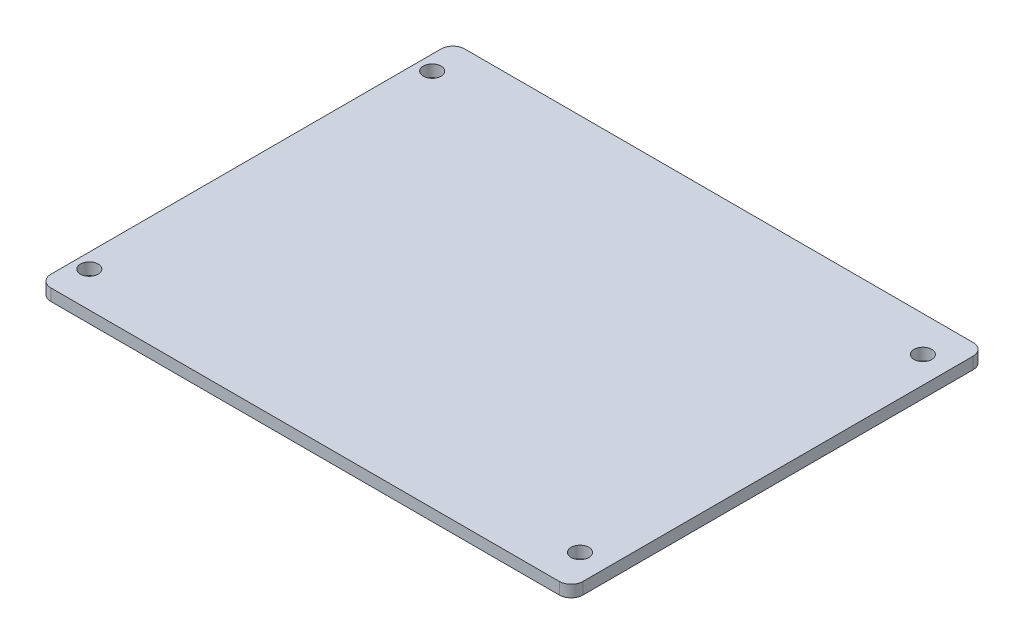
ISO-10303-21;
HEADER;
FILE_DESCRIPTION(('STEP AP214'),'2;1');
FILE_NAME('part.step','',(''),(''),'','','');
FILE_SCHEMA(('AUTOMOTIVE_DESIGN { 1 0 10303 214 1 1 1 1 }'));
ENDSEC;
DATA;
#1=APPLICATION_CONTEXT('core data for automotive mechanical design processes');
#2=APPLICATION_PROTOCOL_DEFINITION('international standard','automotive_design',2000,#1);
#3=PRODUCT_CONTEXT('',#1,'mechanical');
#4=PRODUCT('Part','Part','',(#3));
#5=PRODUCT_RELATED_PRODUCT_CATEGORY('part','',(#4));
#6=PRODUCT_DEFINITION_FORMATION('','',#4);
#7=PRODUCT_DEFINITION_CONTEXT('part definition',#1,'design');
#8=PRODUCT_DEFINITION('design','',#6,#7);
#9=PRODUCT_DEFINITION_SHAPE('','',#8);
#10=(LENGTH_UNIT() NAMED_UNIT(*) SI_UNIT(.MILLI.,.METRE.));
#11=(NAMED_UNIT(*) PLANE_ANGLE_UNIT() SI_UNIT($,.RADIAN.));
#12=(NAMED_UNIT(*) SI_UNIT($,.STERADIAN.) SOLID_ANGLE_UNIT());
#13=UNCERTAINTY_MEASURE_WITH_UNIT(LENGTH_MEASURE(1.E-05),#10,'distance_accuracy_value','');
#14=(GEOMETRIC_REPRESENTATION_CONTEXT(3) GLOBAL_UNCERTAINTY_ASSIGNED_CONTEXT((#13)) GLOBAL_UNIT_ASSIGNED_CONTEXT((#10,
#11,#12)) REPRESENTATION_CONTEXT('',''));
#15=CARTESIAN_POINT('',(0.,0.,0.));
#16=DIRECTION('',(0.,0.,1.));
#17=DIRECTION('',(1.,0.,0.));
#18=AXIS2_PLACEMENT_3D('',#15,#16,#17);
#19=CARTESIAN_POINT('',(0.,2.,0.));
#20=DIRECTION('',(0.,1.,0.));
#21=DIRECTION('',(0.,0.,1.));
#22=AXIS2_PLACEMENT_3D('',#19,#20,#21);
#23=PLANE('',#22);
#24=CARTESIAN_POINT('',(40.5,2.,-29.));
#25=DIRECTION('',(0.,1.,0.));
#26=DIRECTION('',(0.,0.,1.));
#27=AXIS2_PLACEMENT_3D('',#24,#25,#26);
#28=CIRCLE('',#27,1.5);
#29=CARTESIAN_POINT('',(40.5,2.,-27.5));
#30=VERTEX_POINT('',#29);
#31=EDGE_CURVE('E219',#30,#30,#28,.T.);
#32=ORIENTED_EDGE('',*,*,#31,.F.);
#33=EDGE_LOOP('',(#32));
#34=FACE_BOUND('',#33,.T.);
#35=CARTESIAN_POINT('',(-42.5,2.,29.));
#36=DIRECTION('',(0.,1.,0.));
#37=DIRECTION('',(0.,0.,1.));
#38=AXIS2_PLACEMENT_3D('',#35,#36,#37);
#39=CIRCLE('',#38,1.5);
#40=CARTESIAN_POINT('',(-42.5,2.,30.5));
#41=VERTEX_POINT('',#40);
#42=EDGE_CURVE('E144',#41,#41,#39,.T.);
#43=ORIENTED_EDGE('',*,*,#42,.F.);
#44=EDGE_LOOP('',(#43));
#45=FACE_BOUND('',#44,.T.);
#46=DIRECTION('',(0.,0.,1.));
#47=VECTOR('',#46,1.);
#48=CARTESIAN_POINT('',(-45.,2.,-35.));
#49=LINE('',#48,#47);
#50=CARTESIAN_POINT('',(-45.,2.,-33.));
#51=VERTEX_POINT('',#50);
#52=CARTESIAN_POINT('',(-45.,2.,33.));
#53=VERTEX_POINT('',#52);
#54=EDGE_CURVE('E150',#51,#53,#49,.T.);
#55=ORIENTED_EDGE('',*,*,#54,.T.);
#56=CARTESIAN_POINT('',(-43.,2.,33.));
#57=DIRECTION('',(0.,1.,0.));
#58=DIRECTION('',(0.,0.,1.));
#59=AXIS2_PLACEMENT_3D('',#56,#57,#58);
#60=CIRCLE('',#59,2.);
#61=CARTESIAN_POINT('',(-43.,2.,35.));
#62=VERTEX_POINT('',#61);
#63=EDGE_CURVE('E174',#53,#62,#60,.T.);
#64=ORIENTED_EDGE('',*,*,#63,.T.);
#65=DIRECTION('',(1.,0.,0.));
#66=VECTOR('',#65,1.);
#67=CARTESIAN_POINT('',(-45.,2.,35.));
#68=LINE('',#67,#66);
#69=CARTESIAN_POINT('',(43.,2.,35.));
#70=VERTEX_POINT('',#69);
#71=EDGE_CURVE('E127',#62,#70,#68,.T.);
#72=ORIENTED_EDGE('',*,*,#71,.T.);
#73=CARTESIAN_POINT('',(43.,2.,33.));
#74=DIRECTION('',(0.,1.,0.));
#75=DIRECTION('',(0.,0.,1.));
#76=AXIS2_PLACEMENT_3D('',#73,#74,#75);
#77=CIRCLE('',#76,2.);
#78=CARTESIAN_POINT('',(45.,2.,33.));
#79=VERTEX_POINT('',#78);
#80=EDGE_CURVE('E166',#70,#79,#77,.T.);
#81=ORIENTED_EDGE('',*,*,#80,.T.);
#82=DIRECTION('',(0.,0.,-1.));
#83=VECTOR('',#82,1.);
#84=CARTESIAN_POINT('',(45.,2.,-35.));
#85=LINE('',#84,#83);
#86=CARTESIAN_POINT('',(45.,2.,-33.));
#87=VERTEX_POINT('',#86);
#88=EDGE_CURVE('E189',#79,#87,#85,.T.);
#89=ORIENTED_EDGE('',*,*,#88,.T.);
#90=CARTESIAN_POINT('',(43.,2.,-33.));
#91=DIRECTION('',(0.,1.,0.));
#92=DIRECTION('',(0.,0.,1.));
#93=AXIS2_PLACEMENT_3D('',#90,#91,#92);
#94=CIRCLE('',#93,2.);
#95=CARTESIAN_POINT('',(43.,2.,-35.));
#96=VERTEX_POINT('',#95);
#97=EDGE_CURVE('E62',#87,#96,#94,.T.);
#98=ORIENTED_EDGE('',*,*,#97,.T.);
#99=DIRECTION('',(-1.,0.,0.));
#100=VECTOR('',#99,1.);
#101=CARTESIAN_POINT('',(-45.,2.,-35.));
#102=LINE('',#101,#100);
#103=CARTESIAN_POINT('',(-43.,2.,-35.));
#104=VERTEX_POINT('',#103);
#105=EDGE_CURVE('E152',#96,#104,#102,.T.);
#106=ORIENTED_EDGE('',*,*,#105,.T.);
#107=CARTESIAN_POINT('',(-43.,2.,-33.));
#108=DIRECTION('',(0.,1.,0.));
#109=DIRECTION('',(0.,0.,1.));
#110=AXIS2_PLACEMENT_3D('',#107,#108,#109);
#111=CIRCLE('',#110,2.);
#112=EDGE_CURVE('E171',#104,#51,#111,.T.);
#113=ORIENTED_EDGE('',*,*,#112,.T.);
#114=EDGE_LOOP('',(#55,#64,#72,#81,#89,#98,#106,#113));
#115=FACE_BOUND('',#114,.T.);
#116=CARTESIAN_POINT('',(-42.5,2.,-29.));
#117=DIRECTION('',(0.,1.,0.));
#118=DIRECTION('',(0.,0.,1.));
#119=AXIS2_PLACEMENT_3D('',#116,#117,#118);
#120=CIRCLE('',#119,1.5);
#121=CARTESIAN_POINT('',(-42.5,2.,-27.5));
#122=VERTEX_POINT('',#121);
#123=EDGE_CURVE('E211',#122,#122,#120,.T.);
#124=ORIENTED_EDGE('',*,*,#123,.F.);
#125=EDGE_LOOP('',(#124));
#126=FACE_BOUND('',#125,.T.);
#127=CARTESIAN_POINT('',(40.5,2.,29.));
#128=DIRECTION('',(0.,1.,0.));
#129=DIRECTION('',(0.,0.,1.));
#130=AXIS2_PLACEMENT_3D('',#127,#128,#129);
#131=CIRCLE('',#130,1.5);
#132=CARTESIAN_POINT('',(40.5,2.,30.5));
#133=VERTEX_POINT('',#132);
#134=EDGE_CURVE('E227',#133,#133,#131,.T.);
#135=ORIENTED_EDGE('',*,*,#134,.F.);
#136=EDGE_LOOP('',(#135));
#137=FACE_BOUND('',#136,.T.);
#138=ADVANCED_FACE('F39',(#34,#45,#115,#126,#137),#23,.T.);
#139=CARTESIAN_POINT('',(0.,0.,0.));
#140=DIRECTION('',(0.,1.,0.));
#141=DIRECTION('',(0.,0.,1.));
#142=AXIS2_PLACEMENT_3D('',#139,#140,#141);
#143=PLANE('',#142);
#144=DIRECTION('',(1.,0.,0.));
#145=VECTOR('',#144,1.);
#146=CARTESIAN_POINT('',(-45.,0.,35.));
#147=LINE('',#146,#145);
#148=CARTESIAN_POINT('',(-43.,0.,35.));
#149=VERTEX_POINT('',#148);
#150=CARTESIAN_POINT('',(43.,0.,35.));
#151=VERTEX_POINT('',#150);
#152=EDGE_CURVE('E124',#149,#151,#147,.T.);
#153=ORIENTED_EDGE('',*,*,#152,.F.);
#154=CARTESIAN_POINT('',(-43.,0.,33.));
#155=DIRECTION('',(0.,1.,0.));
#156=DIRECTION('',(0.,0.,1.));
#157=AXIS2_PLACEMENT_3D('',#154,#155,#156);
#158=CIRCLE('',#157,2.);
#159=CARTESIAN_POINT('',(-45.,0.,33.));
#160=VERTEX_POINT('',#159);
#161=EDGE_CURVE('E106',#149,#160,#158,.F.);
#162=ORIENTED_EDGE('',*,*,#161,.T.);
#163=DIRECTION('',(0.,0.,1.));
#164=VECTOR('',#163,1.);
#165=CARTESIAN_POINT('',(-45.,0.,-35.));
#166=LINE('',#165,#164);
#167=CARTESIAN_POINT('',(-45.,0.,-33.));
#168=VERTEX_POINT('',#167);
#169=EDGE_CURVE('E137',#168,#160,#166,.T.);
#170=ORIENTED_EDGE('',*,*,#169,.F.);
#171=CARTESIAN_POINT('',(-43.,0.,-33.));
#172=DIRECTION('',(0.,1.,0.));
#173=DIRECTION('',(0.,0.,1.));
#174=AXIS2_PLACEMENT_3D('',#171,#172,#173);
#175=CIRCLE('',#174,2.);
#176=CARTESIAN_POINT('',(-43.,0.,-35.));
#177=VERTEX_POINT('',#176);
#178=EDGE_CURVE('E118',#168,#177,#175,.F.);
#179=ORIENTED_EDGE('',*,*,#178,.T.);
#180=DIRECTION('',(-1.,0.,0.));
#181=VECTOR('',#180,1.);
#182=CARTESIAN_POINT('',(-45.,0.,-35.));
#183=LINE('',#182,#181);
#184=CARTESIAN_POINT('',(43.,0.,-35.));
#185=VERTEX_POINT('',#184);
#186=EDGE_CURVE('E142',#185,#177,#183,.T.);
#187=ORIENTED_EDGE('',*,*,#186,.F.);
#188=CARTESIAN_POINT('',(43.,0.,-33.));
#189=DIRECTION('',(0.,1.,0.));
#190=DIRECTION('',(0.,0.,1.));
#191=AXIS2_PLACEMENT_3D('',#188,#189,#190);
#192=CIRCLE('',#191,2.);
#193=CARTESIAN_POINT('',(45.,0.,-33.));
#194=VERTEX_POINT('',#193);
#195=EDGE_CURVE('E156',#185,#194,#192,.F.);
#196=ORIENTED_EDGE('',*,*,#195,.T.);
#197=DIRECTION('',(0.,0.,-1.));
#198=VECTOR('',#197,1.);
#199=CARTESIAN_POINT('',(45.,0.,-35.));
#200=LINE('',#199,#198);
#201=CARTESIAN_POINT('',(45.,0.,33.));
#202=VERTEX_POINT('',#201);
#203=EDGE_CURVE('E136',#202,#194,#200,.T.);
#204=ORIENTED_EDGE('',*,*,#203,.F.);
#205=CARTESIAN_POINT('',(43.,0.,33.));
#206=DIRECTION('',(0.,1.,0.));
#207=DIRECTION('',(0.,0.,1.));
#208=AXIS2_PLACEMENT_3D('',#205,#206,#207);
#209=CIRCLE('',#208,2.);
#210=EDGE_CURVE('E129',#202,#151,#209,.F.);
#211=ORIENTED_EDGE('',*,*,#210,.T.);
#212=EDGE_LOOP('',(#153,#162,#170,#179,#187,#196,#204,#211));
#213=FACE_BOUND('',#212,.T.);
#214=CARTESIAN_POINT('',(-42.5,0.,29.));
#215=DIRECTION('',(0.,1.,0.));
#216=DIRECTION('',(0.,0.,1.));
#217=AXIS2_PLACEMENT_3D('',#214,#215,#216);
#218=CIRCLE('',#217,1.5);
#219=CARTESIAN_POINT('',(-42.5,0.,30.5));
#220=VERTEX_POINT('',#219);
#221=EDGE_CURVE('E207',#220,#220,#218,.T.);
#222=ORIENTED_EDGE('',*,*,#221,.T.);
#223=EDGE_LOOP('',(#222));
#224=FACE_BOUND('',#223,.T.);
#225=CARTESIAN_POINT('',(-42.5,0.,-29.));
#226=DIRECTION('',(0.,1.,0.));
#227=DIRECTION('',(0.,0.,1.));
#228=AXIS2_PLACEMENT_3D('',#225,#226,#227);
#229=CIRCLE('',#228,1.5);
#230=CARTESIAN_POINT('',(-42.5,0.,-27.5));
#231=VERTEX_POINT('',#230);
#232=EDGE_CURVE('E215',#231,#231,#229,.T.);
#233=ORIENTED_EDGE('',*,*,#232,.T.);
#234=EDGE_LOOP('',(#233));
#235=FACE_BOUND('',#234,.T.);
#236=CARTESIAN_POINT('',(40.5,0.,-29.));
#237=DIRECTION('',(0.,1.,0.));
#238=DIRECTION('',(0.,0.,1.));
#239=AXIS2_PLACEMENT_3D('',#236,#237,#238);
#240=CIRCLE('',#239,1.5);
#241=CARTESIAN_POINT('',(40.5,0.,-27.5));
#242=VERTEX_POINT('',#241);
#243=EDGE_CURVE('E223',#242,#242,#240,.T.);
#244=ORIENTED_EDGE('',*,*,#243,.T.);
#245=EDGE_LOOP('',(#244));
#246=FACE_BOUND('',#245,.T.);
#247=CARTESIAN_POINT('',(40.5,0.,29.));
#248=DIRECTION('',(0.,1.,0.));
#249=DIRECTION('',(0.,0.,1.));
#250=AXIS2_PLACEMENT_3D('',#247,#248,#249);
#251=CIRCLE('',#250,1.5);
#252=CARTESIAN_POINT('',(40.5,0.,30.5));
#253=VERTEX_POINT('',#252);
#254=EDGE_CURVE('E231',#253,#253,#251,.T.);
#255=ORIENTED_EDGE('',*,*,#254,.T.);
#256=EDGE_LOOP('',(#255));
#257=FACE_BOUND('',#256,.T.);
#258=ADVANCED_FACE('F132',(#213,#224,#235,#246,#257),#143,.F.);
#259=CARTESIAN_POINT('',(-45.,2.,-35.));
#260=DIRECTION('',(1.,0.,0.));
#261=DIRECTION('',(0.,0.,-1.));
#262=AXIS2_PLACEMENT_3D('',#259,#260,#261);
#263=PLANE('',#262);
#264=ORIENTED_EDGE('',*,*,#169,.T.);
#265=DIRECTION('',(0.,-1.,0.));
#266=VECTOR('',#265,1.);
#267=CARTESIAN_POINT('',(-45.,2.,33.));
#268=LINE('',#267,#266);
#269=EDGE_CURVE('E111',#160,#53,#268,.F.);
#270=ORIENTED_EDGE('',*,*,#269,.T.);
#271=ORIENTED_EDGE('',*,*,#54,.F.);
#272=DIRECTION('',(0.,-1.,0.));
#273=VECTOR('',#272,1.);
#274=CARTESIAN_POINT('',(-45.,2.,-33.));
#275=LINE('',#274,#273);
#276=EDGE_CURVE('E117',#51,#168,#275,.T.);
#277=ORIENTED_EDGE('',*,*,#276,.T.);
#278=EDGE_LOOP('',(#264,#270,#271,#277));
#279=FACE_BOUND('',#278,.T.);
#280=ADVANCED_FACE('F248',(#279),#263,.F.);
#281=CARTESIAN_POINT('',(-45.,2.,35.));
#282=DIRECTION('',(0.,0.,-1.));
#283=DIRECTION('',(-1.,0.,0.));
#284=AXIS2_PLACEMENT_3D('',#281,#282,#283);
#285=PLANE('',#284);
#286=ORIENTED_EDGE('',*,*,#71,.F.);
#287=DIRECTION('',(0.,-1.,0.));
#288=VECTOR('',#287,1.);
#289=CARTESIAN_POINT('',(-43.,2.,35.));
#290=LINE('',#289,#288);
#291=EDGE_CURVE('E110',#62,#149,#290,.T.);
#292=ORIENTED_EDGE('',*,*,#291,.T.);
#293=ORIENTED_EDGE('',*,*,#152,.T.);
#294=DIRECTION('',(0.,-1.,0.));
#295=VECTOR('',#294,1.);
#296=CARTESIAN_POINT('',(43.,2.,35.));
#297=LINE('',#296,#295);
#298=EDGE_CURVE('E130',#151,#70,#297,.F.);
#299=ORIENTED_EDGE('',*,*,#298,.T.);
#300=EDGE_LOOP('',(#286,#292,#293,#299));
#301=FACE_BOUND('',#300,.T.);
#302=ADVANCED_FACE('F123',(#301),#285,.F.);
#303=CARTESIAN_POINT('',(45.,2.,-35.));
#304=DIRECTION('',(-1.,0.,0.));
#305=DIRECTION('',(0.,0.,1.));
#306=AXIS2_PLACEMENT_3D('',#303,#304,#305);
#307=PLANE('',#306);
#308=ORIENTED_EDGE('',*,*,#203,.T.);
#309=DIRECTION('',(0.,-1.,0.));
#310=VECTOR('',#309,1.);
#311=CARTESIAN_POINT('',(45.,2.,-33.));
#312=LINE('',#311,#310);
#313=EDGE_CURVE('E11',#194,#87,#312,.F.);
#314=ORIENTED_EDGE('',*,*,#313,.T.);
#315=ORIENTED_EDGE('',*,*,#88,.F.);
#316=DIRECTION('',(0.,-1.,0.));
#317=VECTOR('',#316,1.);
#318=CARTESIAN_POINT('',(45.,2.,33.));
#319=LINE('',#318,#317);
#320=EDGE_CURVE('E48',#79,#202,#319,.T.);
#321=ORIENTED_EDGE('',*,*,#320,.T.);
#322=EDGE_LOOP('',(#308,#314,#315,#321));
#323=FACE_BOUND('',#322,.T.);
#324=ADVANCED_FACE('F187',(#323),#307,.F.);
#325=CARTESIAN_POINT('',(-45.,2.,-35.));
#326=DIRECTION('',(0.,0.,1.));
#327=DIRECTION('',(1.,0.,0.));
#328=AXIS2_PLACEMENT_3D('',#325,#326,#327);
#329=PLANE('',#328);
#330=ORIENTED_EDGE('',*,*,#186,.T.);
#331=DIRECTION('',(0.,-1.,0.));
#332=VECTOR('',#331,1.);
#333=CARTESIAN_POINT('',(-43.,2.,-35.));
#334=LINE('',#333,#332);
#335=EDGE_CURVE('E55',#177,#104,#334,.F.);
#336=ORIENTED_EDGE('',*,*,#335,.T.);
#337=ORIENTED_EDGE('',*,*,#105,.F.);
#338=DIRECTION('',(0.,-1.,0.));
#339=VECTOR('',#338,1.);
#340=CARTESIAN_POINT('',(43.,2.,-35.));
#341=LINE('',#340,#339);
#342=EDGE_CURVE('E177',#96,#185,#341,.T.);
#343=ORIENTED_EDGE('',*,*,#342,.T.);
#344=EDGE_LOOP('',(#330,#336,#337,#343));
#345=FACE_BOUND('',#344,.T.);
#346=ADVANCED_FACE('F196',(#345),#329,.F.);
#347=CARTESIAN_POINT('',(-42.5,2.,29.));
#348=DIRECTION('',(0.,-1.,0.));
#349=DIRECTION('',(0.,0.,-1.));
#350=AXIS2_PLACEMENT_3D('',#347,#348,#349);
#351=CYLINDRICAL_SURFACE('',#350,1.5);
#352=ORIENTED_EDGE('',*,*,#42,.T.);
#353=EDGE_LOOP('',(#352));
#354=FACE_BOUND('',#353,.T.);
#355=ORIENTED_EDGE('',*,*,#221,.F.);
#356=EDGE_LOOP('',(#355));
#357=FACE_BOUND('',#356,.T.);
#358=ADVANCED_FACE('F253',(#354,#357),#351,.F.);
#359=CARTESIAN_POINT('',(-42.5,2.,-29.));
#360=DIRECTION('',(0.,-1.,0.));
#361=DIRECTION('',(0.,0.,-1.));
#362=AXIS2_PLACEMENT_3D('',#359,#360,#361);
#363=CYLINDRICAL_SURFACE('',#362,1.5);
#364=ORIENTED_EDGE('',*,*,#123,.T.);
#365=EDGE_LOOP('',(#364));
#366=FACE_BOUND('',#365,.T.);
#367=ORIENTED_EDGE('',*,*,#232,.F.);
#368=EDGE_LOOP('',(#367));
#369=FACE_BOUND('',#368,.T.);
#370=ADVANCED_FACE('F281',(#366,#369),#363,.F.);
#371=CARTESIAN_POINT('',(40.5,2.,-29.));
#372=DIRECTION('',(0.,-1.,0.));
#373=DIRECTION('',(0.,0.,-1.));
#374=AXIS2_PLACEMENT_3D('',#371,#372,#373);
#375=CYLINDRICAL_SURFACE('',#374,1.5);
#376=ORIENTED_EDGE('',*,*,#31,.T.);
#377=EDGE_LOOP('',(#376));
#378=FACE_BOUND('',#377,.T.);
#379=ORIENTED_EDGE('',*,*,#243,.F.);
#380=EDGE_LOOP('',(#379));
#381=FACE_BOUND('',#380,.T.);
#382=ADVANCED_FACE('F284',(#378,#381),#375,.F.);
#383=CARTESIAN_POINT('',(40.5,2.,29.));
#384=DIRECTION('',(0.,-1.,0.));
#385=DIRECTION('',(0.,0.,-1.));
#386=AXIS2_PLACEMENT_3D('',#383,#384,#385);
#387=CYLINDRICAL_SURFACE('',#386,1.5);
#388=ORIENTED_EDGE('',*,*,#134,.T.);
#389=EDGE_LOOP('',(#388));
#390=FACE_BOUND('',#389,.T.);
#391=ORIENTED_EDGE('',*,*,#254,.F.);
#392=EDGE_LOOP('',(#391));
#393=FACE_BOUND('',#392,.T.);
#394=ADVANCED_FACE('F239',(#390,#393),#387,.F.);
#395=CARTESIAN_POINT('',(-43.,2.,33.));
#396=DIRECTION('',(0.,-1.,0.));
#397=DIRECTION('',(0.,0.,-1.));
#398=AXIS2_PLACEMENT_3D('',#395,#396,#397);
#399=CYLINDRICAL_SURFACE('',#398,2.);
#400=ORIENTED_EDGE('',*,*,#63,.F.);
#401=ORIENTED_EDGE('',*,*,#269,.F.);
#402=ORIENTED_EDGE('',*,*,#161,.F.);
#403=ORIENTED_EDGE('',*,*,#291,.F.);
#404=EDGE_LOOP('',(#400,#401,#402,#403));
#405=FACE_BOUND('',#404,.T.);
#406=ADVANCED_FACE('F109',(#405),#399,.T.);
#407=CARTESIAN_POINT('',(-43.,2.,-33.));
#408=DIRECTION('',(0.,-1.,0.));
#409=DIRECTION('',(0.,0.,-1.));
#410=AXIS2_PLACEMENT_3D('',#407,#408,#409);
#411=CYLINDRICAL_SURFACE('',#410,2.);
#412=ORIENTED_EDGE('',*,*,#112,.F.);
#413=ORIENTED_EDGE('',*,*,#335,.F.);
#414=ORIENTED_EDGE('',*,*,#178,.F.);
#415=ORIENTED_EDGE('',*,*,#276,.F.);
#416=EDGE_LOOP('',(#412,#413,#414,#415));
#417=FACE_BOUND('',#416,.T.);
#418=ADVANCED_FACE('F267',(#417),#411,.T.);
#419=CARTESIAN_POINT('',(43.,2.,-33.));
#420=DIRECTION('',(0.,-1.,0.));
#421=DIRECTION('',(0.,0.,-1.));
#422=AXIS2_PLACEMENT_3D('',#419,#420,#421);
#423=CYLINDRICAL_SURFACE('',#422,2.);
#424=ORIENTED_EDGE('',*,*,#97,.F.);
#425=ORIENTED_EDGE('',*,*,#313,.F.);
#426=ORIENTED_EDGE('',*,*,#195,.F.);
#427=ORIENTED_EDGE('',*,*,#342,.F.);
#428=EDGE_LOOP('',(#424,#425,#426,#427));
#429=FACE_BOUND('',#428,.T.);
#430=ADVANCED_FACE('F195',(#429),#423,.T.);
#431=CARTESIAN_POINT('',(43.,2.,33.));
#432=DIRECTION('',(0.,-1.,0.));
#433=DIRECTION('',(0.,0.,-1.));
#434=AXIS2_PLACEMENT_3D('',#431,#432,#433);
#435=CYLINDRICAL_SURFACE('',#434,2.);
#436=ORIENTED_EDGE('',*,*,#80,.F.);
#437=ORIENTED_EDGE('',*,*,#298,.F.);
#438=ORIENTED_EDGE('',*,*,#210,.F.);
#439=ORIENTED_EDGE('',*,*,#320,.F.);
#440=EDGE_LOOP('',(#436,#437,#438,#439));
#441=FACE_BOUND('',#440,.T.);
#442=ADVANCED_FACE('F41',(#441),#435,.T.);
#443=CLOSED_SHELL('',(#138,#258,#280,#302,#324,#346,#358,#370,#382,#394,#406,#418,#430,#442));
#444=MANIFOLD_SOLID_BREP('B2',#443);
#445=ADVANCED_BREP_SHAPE_REPRESENTATION('',(#18,#444),#14);
#446=SHAPE_DEFINITION_REPRESENTATION(#9,#445);
ENDSEC;
END-ISO-10303-21;
